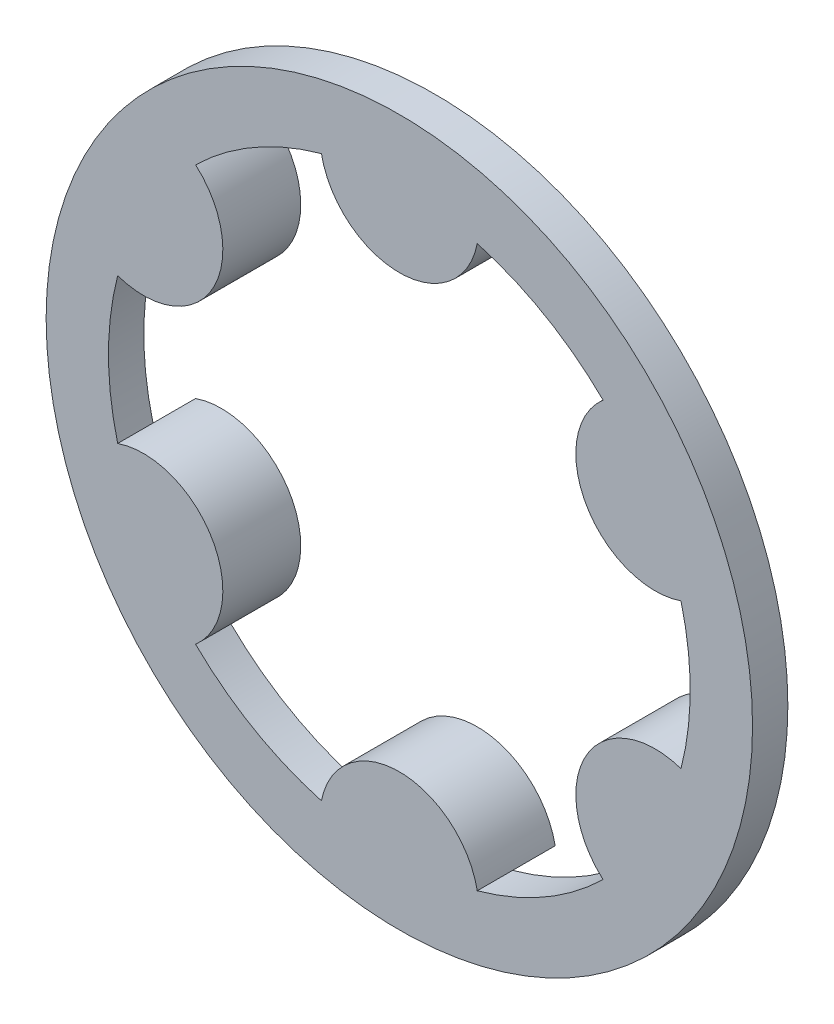
ISO-10303-21;
HEADER;
FILE_DESCRIPTION(('STEP AP214'),'2;1');
FILE_NAME('part.step','',(''),(''),'','','');
FILE_SCHEMA(('AUTOMOTIVE_DESIGN { 1 0 10303 214 1 1 1 1 }'));
ENDSEC;
DATA;
#1=APPLICATION_CONTEXT('core data for automotive mechanical design processes');
#2=APPLICATION_PROTOCOL_DEFINITION('international standard','automotive_design',2000,#1);
#3=PRODUCT_CONTEXT('',#1,'mechanical');
#4=PRODUCT('Part','Part','',(#3));
#5=PRODUCT_RELATED_PRODUCT_CATEGORY('part','',(#4));
#6=PRODUCT_DEFINITION_FORMATION('','',#4);
#7=PRODUCT_DEFINITION_CONTEXT('part definition',#1,'design');
#8=PRODUCT_DEFINITION('design','',#6,#7);
#9=PRODUCT_DEFINITION_SHAPE('','',#8);
#10=(LENGTH_UNIT() NAMED_UNIT(*) SI_UNIT(.MILLI.,.METRE.));
#11=(NAMED_UNIT(*) PLANE_ANGLE_UNIT() SI_UNIT($,.RADIAN.));
#12=(NAMED_UNIT(*) SI_UNIT($,.STERADIAN.) SOLID_ANGLE_UNIT());
#13=UNCERTAINTY_MEASURE_WITH_UNIT(LENGTH_MEASURE(1.E-05),#10,'distance_accuracy_value','');
#14=(GEOMETRIC_REPRESENTATION_CONTEXT(3) GLOBAL_UNCERTAINTY_ASSIGNED_CONTEXT((#13)) GLOBAL_UNIT_ASSIGNED_CONTEXT((#10,
#11,#12)) REPRESENTATION_CONTEXT('',''));
#15=CARTESIAN_POINT('',(0.,0.,0.));
#16=DIRECTION('',(0.,0.,1.));
#17=DIRECTION('',(1.,0.,0.));
#18=AXIS2_PLACEMENT_3D('',#15,#16,#17);
#19=CARTESIAN_POINT('',(0.,0.,3.4));
#20=DIRECTION('',(0.,0.,-1.));
#21=DIRECTION('',(-1.,0.,0.));
#22=AXIS2_PLACEMENT_3D('',#19,#20,#21);
#23=CYLINDRICAL_SURFACE('',#22,28.);
#24=DIRECTION('',(0.,0.,1.));
#25=VECTOR('',#24,1.);
#26=CARTESIAN_POINT('',(-19.6126304169715,19.9836114885995,-4.1));
#27=LINE('',#26,#25);
#28=CARTESIAN_POINT('',(-19.6126304169715,19.9836114885995,0.));
#29=VERTEX_POINT('',#28);
#30=CARTESIAN_POINT('',(-19.6126304169715,19.9836114885995,3.4));
#31=VERTEX_POINT('',#30);
#32=EDGE_CURVE('E180',#29,#31,#27,.T.);
#33=ORIENTED_EDGE('',*,*,#32,.F.);
#34=CARTESIAN_POINT('',(0.,0.,0.));
#35=DIRECTION('',(0.,0.,1.));
#36=DIRECTION('',(1.,0.,0.));
#37=AXIS2_PLACEMENT_3D('',#34,#35,#36);
#38=CIRCLE('',#37,28.);
#39=CARTESIAN_POINT('',(-7.5,26.9768419204324,0.));
#40=VERTEX_POINT('',#39);
#41=EDGE_CURVE('E281',#40,#29,#38,.T.);
#42=ORIENTED_EDGE('',*,*,#41,.F.);
#43=DIRECTION('',(0.,0.,1.));
#44=VECTOR('',#43,1.);
#45=CARTESIAN_POINT('',(-7.5,26.9768419204324,-0.35));
#46=LINE('',#45,#44);
#47=CARTESIAN_POINT('',(-7.5,26.9768419204324,3.4));
#48=VERTEX_POINT('',#47);
#49=EDGE_CURVE('E286',#48,#40,#46,.F.);
#50=ORIENTED_EDGE('',*,*,#49,.F.);
#51=CARTESIAN_POINT('',(0.,0.,3.4));
#52=DIRECTION('',(0.,0.,1.));
#53=DIRECTION('',(1.,0.,0.));
#54=AXIS2_PLACEMENT_3D('',#51,#52,#53);
#55=CIRCLE('',#54,28.);
#56=EDGE_CURVE('E272',#48,#31,#55,.T.);
#57=ORIENTED_EDGE('',*,*,#56,.T.);
#58=EDGE_LOOP('',(#33,#42,#50,#57));
#59=FACE_BOUND('',#58,.T.);
#60=ADVANCED_FACE('F48',(#59),#23,.F.);
#61=DIRECTION('',(0.,0.,1.));
#62=VECTOR('',#61,1.);
#63=CARTESIAN_POINT('',(-27.1126304169715,6.99323043183289,-4.1));
#64=LINE('',#63,#62);
#65=CARTESIAN_POINT('',(-27.1126304169715,6.99323043183288,0.));
#66=VERTEX_POINT('',#65);
#67=CARTESIAN_POINT('',(-27.1126304169715,6.99323043183289,3.4));
#68=VERTEX_POINT('',#67);
#69=EDGE_CURVE('E178',#66,#68,#64,.T.);
#70=ORIENTED_EDGE('',*,*,#69,.T.);
#71=CARTESIAN_POINT('',(-27.1126304169714,-6.99323043183294,3.4));
#72=VERTEX_POINT('',#71);
#73=EDGE_CURVE('E276',#68,#72,#55,.T.);
#74=ORIENTED_EDGE('',*,*,#73,.T.);
#75=DIRECTION('',(0.,0.,1.));
#76=VECTOR('',#75,1.);
#77=CARTESIAN_POINT('',(-27.1126304169714,-6.99323043183294,-4.1));
#78=LINE('',#77,#76);
#79=CARTESIAN_POINT('',(-27.1126304169714,-6.99323043183294,0.));
#80=VERTEX_POINT('',#79);
#81=EDGE_CURVE('E208',#80,#72,#78,.T.);
#82=ORIENTED_EDGE('',*,*,#81,.F.);
#83=EDGE_CURVE('E282',#66,#80,#38,.T.);
#84=ORIENTED_EDGE('',*,*,#83,.F.);
#85=EDGE_LOOP('',(#70,#74,#82,#84));
#86=FACE_BOUND('',#85,.T.);
#87=ADVANCED_FACE('F334',(#86),#23,.F.);
#88=DIRECTION('',(0.,0.,1.));
#89=VECTOR('',#88,1.);
#90=CARTESIAN_POINT('',(-19.6126304169714,-19.9836114885995,-4.1));
#91=LINE('',#90,#89);
#92=CARTESIAN_POINT('',(-19.6126304169714,-19.9836114885995,0.));
#93=VERTEX_POINT('',#92);
#94=CARTESIAN_POINT('',(-19.6126304169714,-19.9836114885995,3.4));
#95=VERTEX_POINT('',#94);
#96=EDGE_CURVE('E201',#93,#95,#91,.T.);
#97=ORIENTED_EDGE('',*,*,#96,.T.);
#98=CARTESIAN_POINT('',(-7.49999999999998,-26.9768419204324,3.4));
#99=VERTEX_POINT('',#98);
#100=EDGE_CURVE('E319',#95,#99,#55,.T.);
#101=ORIENTED_EDGE('',*,*,#100,.T.);
#102=DIRECTION('',(0.,0.,1.));
#103=VECTOR('',#102,1.);
#104=CARTESIAN_POINT('',(-7.49999999999998,-26.9768419204324,-4.1));
#105=LINE('',#104,#103);
#106=CARTESIAN_POINT('',(-7.49999999999998,-26.9768419204324,0.));
#107=VERTEX_POINT('',#106);
#108=EDGE_CURVE('E223',#107,#99,#105,.T.);
#109=ORIENTED_EDGE('',*,*,#108,.F.);
#110=EDGE_CURVE('E354',#93,#107,#38,.T.);
#111=ORIENTED_EDGE('',*,*,#110,.F.);
#112=EDGE_LOOP('',(#97,#101,#109,#111));
#113=FACE_BOUND('',#112,.T.);
#114=ADVANCED_FACE('F365',(#113),#23,.F.);
#115=DIRECTION('',(0.,0.,1.));
#116=VECTOR('',#115,1.);
#117=CARTESIAN_POINT('',(7.50000000000002,-26.9768419204324,-4.1));
#118=LINE('',#117,#116);
#119=CARTESIAN_POINT('',(7.50000000000002,-26.9768419204324,0.));
#120=VERTEX_POINT('',#119);
#121=CARTESIAN_POINT('',(7.50000000000002,-26.9768419204324,3.4));
#122=VERTEX_POINT('',#121);
#123=EDGE_CURVE('E216',#120,#122,#118,.T.);
#124=ORIENTED_EDGE('',*,*,#123,.T.);
#125=CARTESIAN_POINT('',(19.6126304169715,-19.9836114885995,3.4));
#126=VERTEX_POINT('',#125);
#127=EDGE_CURVE('E317',#122,#126,#55,.T.);
#128=ORIENTED_EDGE('',*,*,#127,.T.);
#129=DIRECTION('',(0.,0.,1.));
#130=VECTOR('',#129,1.);
#131=CARTESIAN_POINT('',(19.6126304169715,-19.9836114885995,-4.1));
#132=LINE('',#131,#130);
#133=CARTESIAN_POINT('',(19.6126304169715,-19.9836114885995,0.));
#134=VERTEX_POINT('',#133);
#135=EDGE_CURVE('E239',#134,#126,#132,.T.);
#136=ORIENTED_EDGE('',*,*,#135,.F.);
#137=EDGE_CURVE('E342',#120,#134,#38,.T.);
#138=ORIENTED_EDGE('',*,*,#137,.F.);
#139=EDGE_LOOP('',(#124,#128,#136,#138));
#140=FACE_BOUND('',#139,.T.);
#141=ADVANCED_FACE('F341',(#140),#23,.F.);
#142=DIRECTION('',(0.,0.,1.));
#143=VECTOR('',#142,1.);
#144=CARTESIAN_POINT('',(27.1126304169715,-6.9932304318329,-4.1));
#145=LINE('',#144,#143);
#146=CARTESIAN_POINT('',(27.1126304169715,-6.99323043183291,0.));
#147=VERTEX_POINT('',#146);
#148=CARTESIAN_POINT('',(27.1126304169715,-6.9932304318329,3.4));
#149=VERTEX_POINT('',#148);
#150=EDGE_CURVE('E232',#147,#149,#145,.T.);
#151=ORIENTED_EDGE('',*,*,#150,.T.);
#152=CARTESIAN_POINT('',(27.1126304169715,6.99323043183294,3.4));
#153=VERTEX_POINT('',#152);
#154=EDGE_CURVE('E314',#149,#153,#55,.T.);
#155=ORIENTED_EDGE('',*,*,#154,.T.);
#156=DIRECTION('',(0.,0.,1.));
#157=VECTOR('',#156,1.);
#158=CARTESIAN_POINT('',(27.1126304169715,6.99323043183294,-0.35));
#159=LINE('',#158,#157);
#160=CARTESIAN_POINT('',(27.1126304169715,6.99323043183293,0.));
#161=VERTEX_POINT('',#160);
#162=EDGE_CURVE('E13',#161,#153,#159,.T.);
#163=ORIENTED_EDGE('',*,*,#162,.F.);
#164=EDGE_CURVE('E356',#147,#161,#38,.T.);
#165=ORIENTED_EDGE('',*,*,#164,.F.);
#166=EDGE_LOOP('',(#151,#155,#163,#165));
#167=FACE_BOUND('',#166,.T.);
#168=ADVANCED_FACE('F372',(#167),#23,.F.);
#169=CARTESIAN_POINT('',(0.,0.,3.4));
#170=DIRECTION('',(0.,0.,1.));
#171=DIRECTION('',(1.,0.,0.));
#172=AXIS2_PLACEMENT_3D('',#169,#170,#171);
#173=PLANE('',#172);
#174=CARTESIAN_POINT('',(0.,0.,3.4));
#175=DIRECTION('',(0.,0.,1.));
#176=DIRECTION('',(1.,0.,0.));
#177=AXIS2_PLACEMENT_3D('',#174,#175,#176);
#178=CIRCLE('',#177,34.);
#179=CARTESIAN_POINT('',(34.,0.,3.4));
#180=VERTEX_POINT('',#179);
#181=EDGE_CURVE('E283',#180,#180,#178,.T.);
#182=ORIENTED_EDGE('',*,*,#181,.T.);
#183=EDGE_LOOP('',(#182));
#184=FACE_BOUND('',#183,.T.);
#185=ORIENTED_EDGE('',*,*,#56,.F.);
#186=CARTESIAN_POINT('',(0.,28.4417186424776,3.4));
#187=DIRECTION('',(0.,0.,1.));
#188=DIRECTION('',(1.,0.,0.));
#189=AXIS2_PLACEMENT_3D('',#186,#187,#188);
#190=CIRCLE('',#189,7.64171864247761);
#191=CARTESIAN_POINT('',(7.5,26.9768419204324,3.4));
#192=VERTEX_POINT('',#191);
#193=EDGE_CURVE('E254',#48,#192,#190,.T.);
#194=ORIENTED_EDGE('',*,*,#193,.T.);
#195=CARTESIAN_POINT('',(19.6126304169715,19.9836114885995,3.4));
#196=VERTEX_POINT('',#195);
#197=EDGE_CURVE('E277',#196,#192,#55,.T.);
#198=ORIENTED_EDGE('',*,*,#197,.F.);
#199=CARTESIAN_POINT('',(24.6312508716751,14.2208593212388,3.4));
#200=DIRECTION('',(0.,0.,1.));
#201=DIRECTION('',(1.,0.,0.));
#202=AXIS2_PLACEMENT_3D('',#199,#200,#201);
#203=CIRCLE('',#202,7.64171864247761);
#204=EDGE_CURVE('E238',#196,#153,#203,.T.);
#205=ORIENTED_EDGE('',*,*,#204,.T.);
#206=ORIENTED_EDGE('',*,*,#154,.F.);
#207=CARTESIAN_POINT('',(24.6312508716751,-14.2208593212388,3.4));
#208=DIRECTION('',(0.,0.,1.));
#209=DIRECTION('',(1.,0.,0.));
#210=AXIS2_PLACEMENT_3D('',#207,#208,#209);
#211=CIRCLE('',#210,7.64171864247761);
#212=EDGE_CURVE('E222',#149,#126,#211,.T.);
#213=ORIENTED_EDGE('',*,*,#212,.T.);
#214=ORIENTED_EDGE('',*,*,#127,.F.);
#215=CARTESIAN_POINT('',(0.,-28.4417186424776,3.4));
#216=DIRECTION('',(0.,0.,1.));
#217=DIRECTION('',(1.,0.,0.));
#218=AXIS2_PLACEMENT_3D('',#215,#216,#217);
#219=CIRCLE('',#218,7.64171864247761);
#220=EDGE_CURVE('E207',#122,#99,#219,.T.);
#221=ORIENTED_EDGE('',*,*,#220,.T.);
#222=ORIENTED_EDGE('',*,*,#100,.F.);
#223=CARTESIAN_POINT('',(-24.6312508716751,-14.2208593212388,3.4));
#224=DIRECTION('',(0.,0.,1.));
#225=DIRECTION('',(1.,0.,0.));
#226=AXIS2_PLACEMENT_3D('',#223,#224,#225);
#227=CIRCLE('',#226,7.64171864247761);
#228=EDGE_CURVE('E194',#95,#72,#227,.T.);
#229=ORIENTED_EDGE('',*,*,#228,.T.);
#230=ORIENTED_EDGE('',*,*,#73,.F.);
#231=CARTESIAN_POINT('',(-24.6312508716751,14.2208593212388,3.4));
#232=DIRECTION('',(0.,0.,1.));
#233=DIRECTION('',(1.,0.,0.));
#234=AXIS2_PLACEMENT_3D('',#231,#232,#233);
#235=CIRCLE('',#234,7.64171864247761);
#236=EDGE_CURVE('E187',#68,#31,#235,.T.);
#237=ORIENTED_EDGE('',*,*,#236,.T.);
#238=EDGE_LOOP('',(#185,#194,#198,#205,#206,#213,#214,#221,#222,#229,#230,#237));
#239=FACE_BOUND('',#238,.T.);
#240=ADVANCED_FACE('F313',(#184,#239),#173,.T.);
#241=CARTESIAN_POINT('',(0.,0.,0.));
#242=DIRECTION('',(0.,0.,1.));
#243=DIRECTION('',(1.,0.,0.));
#244=AXIS2_PLACEMENT_3D('',#241,#242,#243);
#245=PLANE('',#244);
#246=CARTESIAN_POINT('',(0.,0.,0.));
#247=DIRECTION('',(0.,0.,1.));
#248=DIRECTION('',(1.,0.,0.));
#249=AXIS2_PLACEMENT_3D('',#246,#247,#248);
#250=CIRCLE('',#249,34.);
#251=CARTESIAN_POINT('',(34.,0.,0.));
#252=VERTEX_POINT('',#251);
#253=EDGE_CURVE('E275',#252,#252,#250,.T.);
#254=ORIENTED_EDGE('',*,*,#253,.F.);
#255=EDGE_LOOP('',(#254));
#256=FACE_BOUND('',#255,.T.);
#257=CARTESIAN_POINT('',(7.5,26.9768419204324,0.));
#258=VERTEX_POINT('',#257);
#259=EDGE_CURVE('E278',#258,#40,#38,.T.);
#260=ORIENTED_EDGE('',*,*,#259,.T.);
#261=ORIENTED_EDGE('',*,*,#41,.T.);
#262=EDGE_CURVE('E357',#29,#66,#38,.T.);
#263=ORIENTED_EDGE('',*,*,#262,.T.);
#264=ORIENTED_EDGE('',*,*,#83,.T.);
#265=EDGE_CURVE('E349',#80,#93,#38,.T.);
#266=ORIENTED_EDGE('',*,*,#265,.T.);
#267=ORIENTED_EDGE('',*,*,#110,.T.);
#268=EDGE_CURVE('E347',#107,#120,#38,.T.);
#269=ORIENTED_EDGE('',*,*,#268,.T.);
#270=ORIENTED_EDGE('',*,*,#137,.T.);
#271=EDGE_CURVE('E348',#134,#147,#38,.T.);
#272=ORIENTED_EDGE('',*,*,#271,.T.);
#273=ORIENTED_EDGE('',*,*,#164,.T.);
#274=CARTESIAN_POINT('',(19.6126304169714,19.9836114885995,0.));
#275=VERTEX_POINT('',#274);
#276=EDGE_CURVE('E303',#161,#275,#38,.T.);
#277=ORIENTED_EDGE('',*,*,#276,.T.);
#278=EDGE_CURVE('E269',#275,#258,#38,.T.);
#279=ORIENTED_EDGE('',*,*,#278,.T.);
#280=EDGE_LOOP('',(#260,#261,#263,#264,#266,#267,#269,#270,#272,#273,#277,#279));
#281=FACE_BOUND('',#280,.T.);
#282=ADVANCED_FACE('F351',(#256,#281),#245,.F.);
#283=CARTESIAN_POINT('',(0.,0.,3.4));
#284=DIRECTION('',(0.,0.,-1.));
#285=DIRECTION('',(-1.,0.,0.));
#286=AXIS2_PLACEMENT_3D('',#283,#284,#285);
#287=CYLINDRICAL_SURFACE('',#286,34.);
#288=ORIENTED_EDGE('',*,*,#181,.F.);
#289=EDGE_LOOP('',(#288));
#290=FACE_BOUND('',#289,.T.);
#291=ORIENTED_EDGE('',*,*,#253,.T.);
#292=EDGE_LOOP('',(#291));
#293=FACE_BOUND('',#292,.T.);
#294=ADVANCED_FACE('F50',(#290,#293),#287,.T.);
#295=DIRECTION('',(0.,0.,1.));
#296=VECTOR('',#295,1.);
#297=CARTESIAN_POINT('',(19.6126304169714,19.9836114885995,-0.35));
#298=LINE('',#297,#296);
#299=EDGE_CURVE('E56',#196,#275,#298,.F.);
#300=ORIENTED_EDGE('',*,*,#299,.F.);
#301=ORIENTED_EDGE('',*,*,#197,.T.);
#302=DIRECTION('',(0.,0.,1.));
#303=VECTOR('',#302,1.);
#304=CARTESIAN_POINT('',(7.5,26.9768419204324,-0.35));
#305=LINE('',#304,#303);
#306=EDGE_CURVE('E291',#258,#192,#305,.T.);
#307=ORIENTED_EDGE('',*,*,#306,.F.);
#308=ORIENTED_EDGE('',*,*,#278,.F.);
#309=EDGE_LOOP('',(#300,#301,#307,#308));
#310=FACE_BOUND('',#309,.T.);
#311=ADVANCED_FACE('F373',(#310),#23,.F.);
#312=CARTESIAN_POINT('',(0.,0.,-4.1));
#313=DIRECTION('',(0.,0.,1.));
#314=DIRECTION('',(1.,0.,0.));
#315=AXIS2_PLACEMENT_3D('',#312,#313,#314);
#316=CYLINDRICAL_SURFACE('',#315,28.);
#317=ORIENTED_EDGE('',*,*,#259,.F.);
#318=DIRECTION('',(0.,0.,1.));
#319=VECTOR('',#318,1.);
#320=CARTESIAN_POINT('',(7.5,26.9768419204324,-4.1));
#321=LINE('',#320,#319);
#322=CARTESIAN_POINT('',(7.5,26.9768419204324,-4.1));
#323=VERTEX_POINT('',#322);
#324=EDGE_CURVE('E266',#323,#258,#321,.T.);
#325=ORIENTED_EDGE('',*,*,#324,.F.);
#326=CARTESIAN_POINT('',(0.,0.,-4.1));
#327=DIRECTION('',(0.,0.,1.));
#328=DIRECTION('',(-1.,0.,0.));
#329=AXIS2_PLACEMENT_3D('',#326,#327,#328);
#330=CIRCLE('',#329,28.);
#331=CARTESIAN_POINT('',(-7.5,26.9768419204324,-4.1));
#332=VERTEX_POINT('',#331);
#333=EDGE_CURVE('E257',#323,#332,#330,.T.);
#334=ORIENTED_EDGE('',*,*,#333,.T.);
#335=DIRECTION('',(0.,0.,1.));
#336=VECTOR('',#335,1.);
#337=CARTESIAN_POINT('',(-7.5,26.9768419204324,-4.1));
#338=LINE('',#337,#336);
#339=EDGE_CURVE('E263',#332,#40,#338,.T.);
#340=ORIENTED_EDGE('',*,*,#339,.T.);
#341=EDGE_LOOP('',(#317,#325,#334,#340));
#342=FACE_BOUND('',#341,.T.);
#343=ADVANCED_FACE('F382',(#342),#316,.T.);
#344=CARTESIAN_POINT('',(0.,28.4417186424776,-4.1));
#345=DIRECTION('',(0.,0.,1.));
#346=DIRECTION('',(1.,0.,0.));
#347=AXIS2_PLACEMENT_3D('',#344,#345,#346);
#348=CYLINDRICAL_SURFACE('',#347,7.64171864247761);
#349=ORIENTED_EDGE('',*,*,#193,.F.);
#350=ORIENTED_EDGE('',*,*,#49,.T.);
#351=ORIENTED_EDGE('',*,*,#339,.F.);
#352=CARTESIAN_POINT('',(0.,28.4417186424776,-4.1));
#353=DIRECTION('',(0.,0.,1.));
#354=DIRECTION('',(1.,0.,0.));
#355=AXIS2_PLACEMENT_3D('',#352,#353,#354);
#356=CIRCLE('',#355,7.64171864247761);
#357=EDGE_CURVE('E260',#332,#323,#356,.T.);
#358=ORIENTED_EDGE('',*,*,#357,.T.);
#359=ORIENTED_EDGE('',*,*,#324,.T.);
#360=ORIENTED_EDGE('',*,*,#306,.T.);
#361=EDGE_LOOP('',(#349,#350,#351,#358,#359,#360));
#362=FACE_BOUND('',#361,.T.);
#363=ADVANCED_FACE('F387',(#362),#348,.T.);
#364=CARTESIAN_POINT('',(0.,14.2208593212388,-4.1));
#365=DIRECTION('',(0.,0.,-1.));
#366=DIRECTION('',(-1.,0.,0.));
#367=AXIS2_PLACEMENT_3D('',#364,#365,#366);
#368=PLANE('',#367);
#369=ORIENTED_EDGE('',*,*,#333,.F.);
#370=ORIENTED_EDGE('',*,*,#357,.F.);
#371=EDGE_LOOP('',(#369,#370));
#372=FACE_BOUND('',#371,.T.);
#373=ADVANCED_FACE('F423',(#372),#368,.T.);
#374=CARTESIAN_POINT('',(0.,0.,-4.1));
#375=DIRECTION('',(0.,0.,1.));
#376=DIRECTION('',(1.,0.,0.));
#377=AXIS2_PLACEMENT_3D('',#374,#375,#376);
#378=CYLINDRICAL_SURFACE('',#377,28.);
#379=ORIENTED_EDGE('',*,*,#276,.F.);
#380=DIRECTION('',(0.,0.,1.));
#381=VECTOR('',#380,1.);
#382=CARTESIAN_POINT('',(27.1126304169715,6.99323043183294,-4.1));
#383=LINE('',#382,#381);
#384=CARTESIAN_POINT('',(27.1126304169715,6.99323043183294,-4.1));
#385=VERTEX_POINT('',#384);
#386=EDGE_CURVE('E251',#385,#161,#383,.T.);
#387=ORIENTED_EDGE('',*,*,#386,.F.);
#388=CARTESIAN_POINT('',(0.,0.,-4.1));
#389=DIRECTION('',(0.,0.,1.));
#390=DIRECTION('',(-1.,0.,0.));
#391=AXIS2_PLACEMENT_3D('',#388,#389,#390);
#392=CIRCLE('',#391,28.);
#393=CARTESIAN_POINT('',(19.6126304169715,19.9836114885995,-4.1));
#394=VERTEX_POINT('',#393);
#395=EDGE_CURVE('E242',#385,#394,#392,.T.);
#396=ORIENTED_EDGE('',*,*,#395,.T.);
#397=DIRECTION('',(0.,0.,1.));
#398=VECTOR('',#397,1.);
#399=CARTESIAN_POINT('',(19.6126304169715,19.9836114885995,-4.1));
#400=LINE('',#399,#398);
#401=EDGE_CURVE('E248',#394,#275,#400,.T.);
#402=ORIENTED_EDGE('',*,*,#401,.T.);
#403=EDGE_LOOP('',(#379,#387,#396,#402));
#404=FACE_BOUND('',#403,.T.);
#405=ADVANCED_FACE('F301',(#404),#378,.T.);
#406=CARTESIAN_POINT('',(24.6312508716751,14.2208593212388,-4.1));
#407=DIRECTION('',(0.,0.,1.));
#408=DIRECTION('',(1.,0.,0.));
#409=AXIS2_PLACEMENT_3D('',#406,#407,#408);
#410=CYLINDRICAL_SURFACE('',#409,7.64171864247761);
#411=ORIENTED_EDGE('',*,*,#204,.F.);
#412=ORIENTED_EDGE('',*,*,#299,.T.);
#413=ORIENTED_EDGE('',*,*,#401,.F.);
#414=CARTESIAN_POINT('',(24.6312508716751,14.2208593212388,-4.1));
#415=DIRECTION('',(0.,0.,1.));
#416=DIRECTION('',(1.,0.,0.));
#417=AXIS2_PLACEMENT_3D('',#414,#415,#416);
#418=CIRCLE('',#417,7.64171864247761);
#419=EDGE_CURVE('E245',#394,#385,#418,.T.);
#420=ORIENTED_EDGE('',*,*,#419,.T.);
#421=ORIENTED_EDGE('',*,*,#386,.T.);
#422=ORIENTED_EDGE('',*,*,#162,.T.);
#423=EDGE_LOOP('',(#411,#412,#413,#420,#421,#422));
#424=FACE_BOUND('',#423,.T.);
#425=ADVANCED_FACE('F297',(#424),#410,.T.);
#426=CARTESIAN_POINT('',(12.3156254358375,7.11042966061941,-4.1));
#427=DIRECTION('',(0.,0.,-1.));
#428=DIRECTION('',(-1.,0.,0.));
#429=AXIS2_PLACEMENT_3D('',#426,#427,#428);
#430=PLANE('',#429);
#431=ORIENTED_EDGE('',*,*,#395,.F.);
#432=ORIENTED_EDGE('',*,*,#419,.F.);
#433=EDGE_LOOP('',(#431,#432));
#434=FACE_BOUND('',#433,.T.);
#435=ADVANCED_FACE('F307',(#434),#430,.T.);
#436=CARTESIAN_POINT('',(0.,0.,-4.1));
#437=DIRECTION('',(0.,0.,1.));
#438=DIRECTION('',(1.,0.,0.));
#439=AXIS2_PLACEMENT_3D('',#436,#437,#438);
#440=CYLINDRICAL_SURFACE('',#439,28.);
#441=ORIENTED_EDGE('',*,*,#271,.F.);
#442=CARTESIAN_POINT('',(19.6126304169715,-19.9836114885995,-4.1));
#443=VERTEX_POINT('',#442);
#444=EDGE_CURVE('E235',#443,#134,#132,.T.);
#445=ORIENTED_EDGE('',*,*,#444,.F.);
#446=CARTESIAN_POINT('',(0.,0.,-4.1));
#447=DIRECTION('',(0.,0.,1.));
#448=DIRECTION('',(-1.,0.,0.));
#449=AXIS2_PLACEMENT_3D('',#446,#447,#448);
#450=CIRCLE('',#449,28.);
#451=CARTESIAN_POINT('',(27.1126304169715,-6.9932304318329,-4.1));
#452=VERTEX_POINT('',#451);
#453=EDGE_CURVE('E226',#443,#452,#450,.T.);
#454=ORIENTED_EDGE('',*,*,#453,.T.);
#455=EDGE_CURVE('E240',#452,#147,#145,.T.);
#456=ORIENTED_EDGE('',*,*,#455,.T.);
#457=EDGE_LOOP('',(#441,#445,#454,#456));
#458=FACE_BOUND('',#457,.T.);
#459=ADVANCED_FACE('F401',(#458),#440,.T.);
#460=CARTESIAN_POINT('',(24.6312508716751,-14.2208593212388,-4.1));
#461=DIRECTION('',(0.,0.,1.));
#462=DIRECTION('',(1.,0.,0.));
#463=AXIS2_PLACEMENT_3D('',#460,#461,#462);
#464=CYLINDRICAL_SURFACE('',#463,7.64171864247761);
#465=ORIENTED_EDGE('',*,*,#212,.F.);
#466=ORIENTED_EDGE('',*,*,#150,.F.);
#467=ORIENTED_EDGE('',*,*,#455,.F.);
#468=CARTESIAN_POINT('',(24.6312508716751,-14.2208593212388,-4.1));
#469=DIRECTION('',(0.,0.,1.));
#470=DIRECTION('',(1.,0.,0.));
#471=AXIS2_PLACEMENT_3D('',#468,#469,#470);
#472=CIRCLE('',#471,7.64171864247761);
#473=EDGE_CURVE('E229',#452,#443,#472,.T.);
#474=ORIENTED_EDGE('',*,*,#473,.T.);
#475=ORIENTED_EDGE('',*,*,#444,.T.);
#476=ORIENTED_EDGE('',*,*,#135,.T.);
#477=EDGE_LOOP('',(#465,#466,#467,#474,#475,#476));
#478=FACE_BOUND('',#477,.T.);
#479=ADVANCED_FACE('F397',(#478),#464,.T.);
#480=CARTESIAN_POINT('',(12.3156254358375,-7.1104296606194,-4.1));
#481=DIRECTION('',(0.,0.,-1.));
#482=DIRECTION('',(-1.,0.,0.));
#483=AXIS2_PLACEMENT_3D('',#480,#481,#482);
#484=PLANE('',#483);
#485=ORIENTED_EDGE('',*,*,#453,.F.);
#486=ORIENTED_EDGE('',*,*,#473,.F.);
#487=EDGE_LOOP('',(#485,#486));
#488=FACE_BOUND('',#487,.T.);
#489=ADVANCED_FACE('F403',(#488),#484,.T.);
#490=CARTESIAN_POINT('',(0.,0.,-4.1));
#491=DIRECTION('',(0.,0.,1.));
#492=DIRECTION('',(1.,0.,0.));
#493=AXIS2_PLACEMENT_3D('',#490,#491,#492);
#494=CYLINDRICAL_SURFACE('',#493,28.);
#495=ORIENTED_EDGE('',*,*,#268,.F.);
#496=CARTESIAN_POINT('',(-7.49999999999998,-26.9768419204324,-4.1));
#497=VERTEX_POINT('',#496);
#498=EDGE_CURVE('E219',#497,#107,#105,.T.);
#499=ORIENTED_EDGE('',*,*,#498,.F.);
#500=CARTESIAN_POINT('',(0.,0.,-4.1));
#501=DIRECTION('',(0.,0.,1.));
#502=DIRECTION('',(-1.,0.,0.));
#503=AXIS2_PLACEMENT_3D('',#500,#501,#502);
#504=CIRCLE('',#503,28.);
#505=CARTESIAN_POINT('',(7.50000000000002,-26.9768419204324,-4.1));
#506=VERTEX_POINT('',#505);
#507=EDGE_CURVE('E210',#497,#506,#504,.T.);
#508=ORIENTED_EDGE('',*,*,#507,.T.);
#509=EDGE_CURVE('E224',#506,#120,#118,.T.);
#510=ORIENTED_EDGE('',*,*,#509,.T.);
#511=EDGE_LOOP('',(#495,#499,#508,#510));
#512=FACE_BOUND('',#511,.T.);
#513=ADVANCED_FACE('F405',(#512),#494,.T.);
#514=CARTESIAN_POINT('',(0.,-28.4417186424776,-4.1));
#515=DIRECTION('',(0.,0.,1.));
#516=DIRECTION('',(1.,0.,0.));
#517=AXIS2_PLACEMENT_3D('',#514,#515,#516);
#518=CYLINDRICAL_SURFACE('',#517,7.64171864247761);
#519=ORIENTED_EDGE('',*,*,#220,.F.);
#520=ORIENTED_EDGE('',*,*,#123,.F.);
#521=ORIENTED_EDGE('',*,*,#509,.F.);
#522=CARTESIAN_POINT('',(0.,-28.4417186424776,-4.1));
#523=DIRECTION('',(0.,0.,1.));
#524=DIRECTION('',(1.,0.,0.));
#525=AXIS2_PLACEMENT_3D('',#522,#523,#524);
#526=CIRCLE('',#525,7.64171864247761);
#527=EDGE_CURVE('E213',#506,#497,#526,.T.);
#528=ORIENTED_EDGE('',*,*,#527,.T.);
#529=ORIENTED_EDGE('',*,*,#498,.T.);
#530=ORIENTED_EDGE('',*,*,#108,.T.);
#531=EDGE_LOOP('',(#519,#520,#521,#528,#529,#530));
#532=FACE_BOUND('',#531,.T.);
#533=ADVANCED_FACE('F339',(#532),#518,.T.);
#534=CARTESIAN_POINT('',(0.,-14.2208593212388,-4.1));
#535=DIRECTION('',(0.,0.,-1.));
#536=DIRECTION('',(-1.,0.,0.));
#537=AXIS2_PLACEMENT_3D('',#534,#535,#536);
#538=PLANE('',#537);
#539=ORIENTED_EDGE('',*,*,#507,.F.);
#540=ORIENTED_EDGE('',*,*,#527,.F.);
#541=EDGE_LOOP('',(#539,#540));
#542=FACE_BOUND('',#541,.T.);
#543=ADVANCED_FACE('F480',(#542),#538,.T.);
#544=CARTESIAN_POINT('',(0.,0.,-4.1));
#545=DIRECTION('',(0.,0.,1.));
#546=DIRECTION('',(1.,0.,0.));
#547=AXIS2_PLACEMENT_3D('',#544,#545,#546);
#548=CYLINDRICAL_SURFACE('',#547,28.);
#549=ORIENTED_EDGE('',*,*,#265,.F.);
#550=CARTESIAN_POINT('',(-27.1126304169714,-6.99323043183294,-4.1));
#551=VERTEX_POINT('',#550);
#552=EDGE_CURVE('E204',#551,#80,#78,.T.);
#553=ORIENTED_EDGE('',*,*,#552,.F.);
#554=CARTESIAN_POINT('',(0.,0.,-4.1));
#555=DIRECTION('',(0.,0.,1.));
#556=DIRECTION('',(-1.,0.,0.));
#557=AXIS2_PLACEMENT_3D('',#554,#555,#556);
#558=CIRCLE('',#557,28.);
#559=CARTESIAN_POINT('',(-19.6126304169714,-19.9836114885995,-4.1));
#560=VERTEX_POINT('',#559);
#561=EDGE_CURVE('E196',#551,#560,#558,.T.);
#562=ORIENTED_EDGE('',*,*,#561,.T.);
#563=EDGE_CURVE('E71',#560,#93,#91,.T.);
#564=ORIENTED_EDGE('',*,*,#563,.T.);
#565=EDGE_LOOP('',(#549,#553,#562,#564));
#566=FACE_BOUND('',#565,.T.);
#567=ADVANCED_FACE('F360',(#566),#548,.T.);
#568=CARTESIAN_POINT('',(-24.6312508716751,-14.2208593212388,-4.1));
#569=DIRECTION('',(0.,0.,1.));
#570=DIRECTION('',(1.,0.,0.));
#571=AXIS2_PLACEMENT_3D('',#568,#569,#570);
#572=CYLINDRICAL_SURFACE('',#571,7.64171864247761);
#573=ORIENTED_EDGE('',*,*,#228,.F.);
#574=ORIENTED_EDGE('',*,*,#96,.F.);
#575=ORIENTED_EDGE('',*,*,#563,.F.);
#576=CARTESIAN_POINT('',(-24.6312508716751,-14.2208593212388,-4.1));
#577=DIRECTION('',(0.,0.,1.));
#578=DIRECTION('',(1.,0.,0.));
#579=AXIS2_PLACEMENT_3D('',#576,#577,#578);
#580=CIRCLE('',#579,7.64171864247761);
#581=EDGE_CURVE('E198',#560,#551,#580,.T.);
#582=ORIENTED_EDGE('',*,*,#581,.T.);
#583=ORIENTED_EDGE('',*,*,#552,.T.);
#584=ORIENTED_EDGE('',*,*,#81,.T.);
#585=EDGE_LOOP('',(#573,#574,#575,#582,#583,#584));
#586=FACE_BOUND('',#585,.T.);
#587=ADVANCED_FACE('F336',(#586),#572,.T.);
#588=CARTESIAN_POINT('',(-12.3156254358375,-7.11042966061941,-4.1));
#589=DIRECTION('',(0.,0.,-1.));
#590=DIRECTION('',(-1.,0.,0.));
#591=AXIS2_PLACEMENT_3D('',#588,#589,#590);
#592=PLANE('',#591);
#593=ORIENTED_EDGE('',*,*,#561,.F.);
#594=ORIENTED_EDGE('',*,*,#581,.F.);
#595=EDGE_LOOP('',(#593,#594));
#596=FACE_BOUND('',#595,.T.);
#597=ADVANCED_FACE('F364',(#596),#592,.T.);
#598=CARTESIAN_POINT('',(0.,0.,-4.1));
#599=DIRECTION('',(0.,0.,1.));
#600=DIRECTION('',(1.,0.,0.));
#601=AXIS2_PLACEMENT_3D('',#598,#599,#600);
#602=CYLINDRICAL_SURFACE('',#601,28.);
#603=ORIENTED_EDGE('',*,*,#262,.F.);
#604=CARTESIAN_POINT('',(-19.6126304169715,19.9836114885995,-4.1));
#605=VERTEX_POINT('',#604);
#606=EDGE_CURVE('E185',#605,#29,#27,.T.);
#607=ORIENTED_EDGE('',*,*,#606,.F.);
#608=CARTESIAN_POINT('',(0.,0.,-4.1));
#609=DIRECTION('',(0.,0.,1.));
#610=DIRECTION('',(-1.,0.,0.));
#611=AXIS2_PLACEMENT_3D('',#608,#609,#610);
#612=CIRCLE('',#611,28.);
#613=CARTESIAN_POINT('',(-27.1126304169715,6.99323043183289,-4.1));
#614=VERTEX_POINT('',#613);
#615=EDGE_CURVE('E183',#605,#614,#612,.T.);
#616=ORIENTED_EDGE('',*,*,#615,.T.);
#617=EDGE_CURVE('E63',#614,#66,#64,.T.);
#618=ORIENTED_EDGE('',*,*,#617,.T.);
#619=EDGE_LOOP('',(#603,#607,#616,#618));
#620=FACE_BOUND('',#619,.T.);
#621=ADVANCED_FACE('F184',(#620),#602,.T.);
#622=CARTESIAN_POINT('',(-24.6312508716751,14.2208593212388,-4.1));
#623=DIRECTION('',(0.,0.,1.));
#624=DIRECTION('',(1.,0.,0.));
#625=AXIS2_PLACEMENT_3D('',#622,#623,#624);
#626=CYLINDRICAL_SURFACE('',#625,7.64171864247761);
#627=ORIENTED_EDGE('',*,*,#236,.F.);
#628=ORIENTED_EDGE('',*,*,#69,.F.);
#629=ORIENTED_EDGE('',*,*,#617,.F.);
#630=CARTESIAN_POINT('',(-24.6312508716751,14.2208593212388,-4.1));
#631=DIRECTION('',(0.,0.,1.));
#632=DIRECTION('',(1.,0.,0.));
#633=AXIS2_PLACEMENT_3D('',#630,#631,#632);
#634=CIRCLE('',#633,7.64171864247761);
#635=EDGE_CURVE('E176',#614,#605,#634,.T.);
#636=ORIENTED_EDGE('',*,*,#635,.T.);
#637=ORIENTED_EDGE('',*,*,#606,.T.);
#638=ORIENTED_EDGE('',*,*,#32,.T.);
#639=EDGE_LOOP('',(#627,#628,#629,#636,#637,#638));
#640=FACE_BOUND('',#639,.T.);
#641=ADVANCED_FACE('F173',(#640),#626,.T.);
#642=CARTESIAN_POINT('',(-12.3156254358375,7.11042966061939,-4.1));
#643=DIRECTION('',(0.,0.,-1.));
#644=DIRECTION('',(-1.,0.,0.));
#645=AXIS2_PLACEMENT_3D('',#642,#643,#644);
#646=PLANE('',#645);
#647=ORIENTED_EDGE('',*,*,#615,.F.);
#648=ORIENTED_EDGE('',*,*,#635,.F.);
#649=EDGE_LOOP('',(#647,#648));
#650=FACE_BOUND('',#649,.T.);
#651=ADVANCED_FACE('F189',(#650),#646,.T.);
#652=CLOSED_SHELL('',(#60,#87,#114,#141,#168,#240,#282,#294,#311,#343,#363,#373,#405,#425,#435,
#459,#479,#489,#513,#533,#543,#567,#587,#597,#621,#641,#651));
#653=MANIFOLD_SOLID_BREP('B2',#652);
#654=ADVANCED_BREP_SHAPE_REPRESENTATION('',(#18,#653),#14);
#655=SHAPE_DEFINITION_REPRESENTATION(#9,#654);
ENDSEC;
END-ISO-10303-21;
